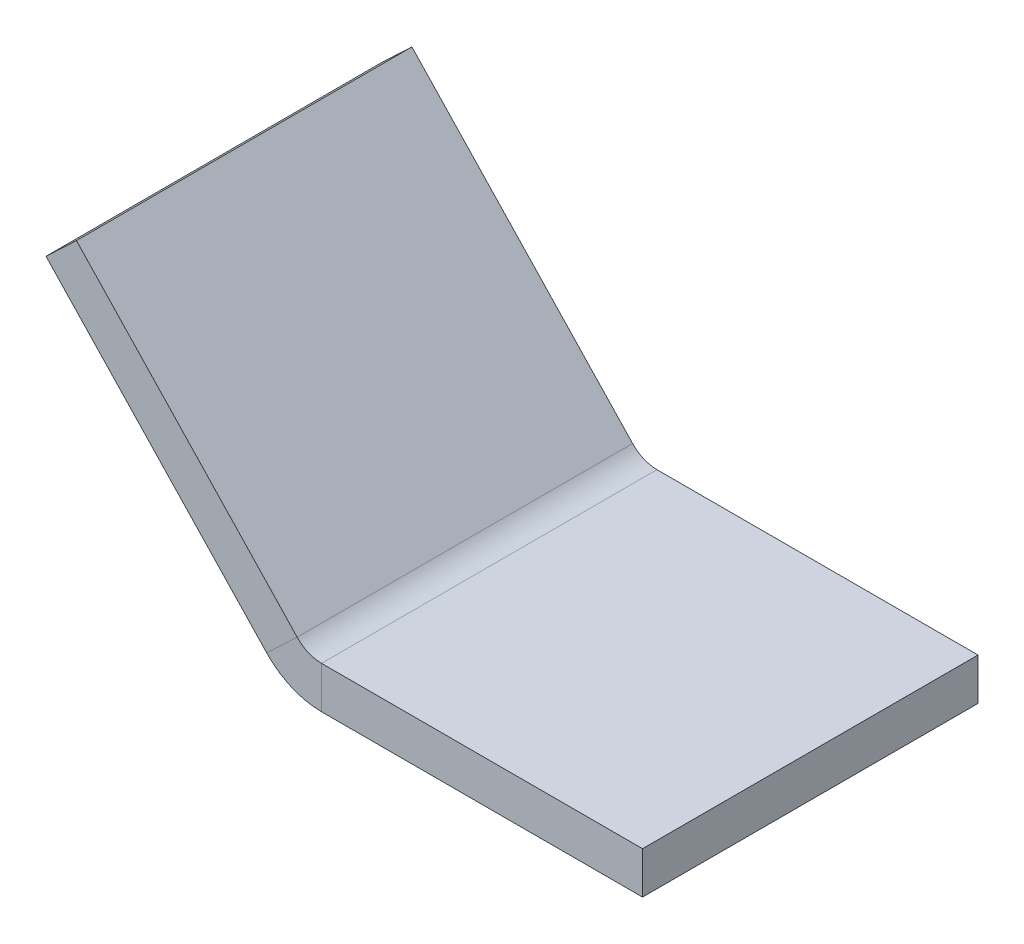
ISO-10303-21;
HEADER;
FILE_DESCRIPTION(('STEP AP214'),'2;1');
FILE_NAME('part.step','',(''),(''),'','','');
FILE_SCHEMA(('AUTOMOTIVE_DESIGN { 1 0 10303 214 1 1 1 1 }'));
ENDSEC;
DATA;
#1=APPLICATION_CONTEXT('core data for automotive mechanical design processes');
#2=APPLICATION_PROTOCOL_DEFINITION('international standard','automotive_design',2000,#1);
#3=PRODUCT_CONTEXT('',#1,'mechanical');
#4=PRODUCT('Part','Part','',(#3));
#5=PRODUCT_RELATED_PRODUCT_CATEGORY('part','',(#4));
#6=PRODUCT_DEFINITION_FORMATION('','',#4);
#7=PRODUCT_DEFINITION_CONTEXT('part definition',#1,'design');
#8=PRODUCT_DEFINITION('design','',#6,#7);
#9=PRODUCT_DEFINITION_SHAPE('','',#8);
#10=(LENGTH_UNIT() NAMED_UNIT(*) SI_UNIT(.MILLI.,.METRE.));
#11=(NAMED_UNIT(*) PLANE_ANGLE_UNIT() SI_UNIT($,.RADIAN.));
#12=(NAMED_UNIT(*) SI_UNIT($,.STERADIAN.) SOLID_ANGLE_UNIT());
#13=UNCERTAINTY_MEASURE_WITH_UNIT(LENGTH_MEASURE(1.E-05),#10,'distance_accuracy_value','');
#14=(GEOMETRIC_REPRESENTATION_CONTEXT(3) GLOBAL_UNCERTAINTY_ASSIGNED_CONTEXT((#13)) GLOBAL_UNIT_ASSIGNED_CONTEXT((#10,
#11,#12)) REPRESENTATION_CONTEXT('',''));
#15=CARTESIAN_POINT('',(0.,0.,0.));
#16=DIRECTION('',(0.,0.,1.));
#17=DIRECTION('',(1.,0.,0.));
#18=AXIS2_PLACEMENT_3D('',#15,#16,#17);
#19=CARTESIAN_POINT('',(0.546520994959475,0.,12.7));
#20=DIRECTION('',(0.,0.,1.));
#21=DIRECTION('',(1.,0.,0.));
#22=AXIS2_PLACEMENT_3D('',#19,#20,#21);
#23=PLANE('',#22);
#24=DIRECTION('',(0.,-1.,0.));
#25=VECTOR('',#24,1.);
#26=CARTESIAN_POINT('',(0.546520994959475,0.,12.7));
#27=LINE('',#26,#25);
#28=CARTESIAN_POINT('',(0.546520994959475,0.,12.7));
#29=VERTEX_POINT('',#28);
#30=CARTESIAN_POINT('',(0.546520994959475,-1.5875,12.7));
#31=VERTEX_POINT('',#30);
#32=EDGE_CURVE('E11',#29,#31,#27,.T.);
#33=ORIENTED_EDGE('',*,*,#32,.F.);
#34=CARTESIAN_POINT('',(0.546520994959475,1.27,12.7));
#35=DIRECTION('',(0.,0.,1.));
#36=DIRECTION('',(1.,0.,0.));
#37=AXIS2_PLACEMENT_3D('',#34,#35,#36);
#38=CIRCLE('',#37,1.27);
#39=CARTESIAN_POINT('',(-0.375733177885114,0.396875014290195,12.7));
#40=VERTEX_POINT('',#39);
#41=EDGE_CURVE('E143',#40,#29,#38,.T.);
#42=ORIENTED_EDGE('',*,*,#41,.F.);
#43=DIRECTION('',(0.726184388066605,0.687499988747876,0.));
#44=VECTOR('',#43,1.);
#45=CARTESIAN_POINT('',(-1.52855089394085,-0.694531217847057,12.7));
#46=LINE('',#45,#44);
#47=CARTESIAN_POINT('',(-1.52855089394085,-0.694531217847057,12.7));
#48=VERTEX_POINT('',#47);
#49=EDGE_CURVE('E49',#48,#40,#46,.T.);
#50=ORIENTED_EDGE('',*,*,#49,.F.);
#51=CARTESIAN_POINT('',(0.546520994959475,1.27,12.7));
#52=DIRECTION('',(0.,0.,1.));
#53=DIRECTION('',(1.,0.,0.));
#54=AXIS2_PLACEMENT_3D('',#51,#52,#53);
#55=CIRCLE('',#54,2.8575);
#56=EDGE_CURVE('E133',#48,#31,#55,.T.);
#57=ORIENTED_EDGE('',*,*,#56,.T.);
#58=EDGE_LOOP('',(#33,#42,#50,#57));
#59=FACE_BOUND('',#58,.T.);
#60=ADVANCED_FACE('F40',(#59),#23,.T.);
#61=CARTESIAN_POINT('',(-1.52855089394085,-0.694531217847057,12.7));
#62=DIRECTION('',(0.,0.,1.));
#63=DIRECTION('',(1.,0.,0.));
#64=AXIS2_PLACEMENT_3D('',#61,#62,#63);
#65=PLANE('',#64);
#66=DIRECTION('',(1.,0.,0.));
#67=VECTOR('',#66,1.);
#68=CARTESIAN_POINT('',(0.,0.,12.7));
#69=LINE('',#68,#67);
#70=CARTESIAN_POINT('',(12.7,0.,12.7));
#71=VERTEX_POINT('',#70);
#72=EDGE_CURVE('E213',#29,#71,#69,.T.);
#73=ORIENTED_EDGE('',*,*,#72,.F.);
#74=ORIENTED_EDGE('',*,*,#32,.T.);
#75=DIRECTION('',(1.,0.,0.));
#76=VECTOR('',#75,1.);
#77=CARTESIAN_POINT('',(0.,-1.5875,12.7));
#78=LINE('',#77,#76);
#79=CARTESIAN_POINT('',(12.7,-1.5875,12.7));
#80=VERTEX_POINT('',#79);
#81=EDGE_CURVE('E97',#31,#80,#78,.T.);
#82=ORIENTED_EDGE('',*,*,#81,.T.);
#83=DIRECTION('',(0.,-1.,0.));
#84=VECTOR('',#83,1.);
#85=CARTESIAN_POINT('',(12.7,0.,12.7));
#86=LINE('',#85,#84);
#87=EDGE_CURVE('E399',#71,#80,#86,.T.);
#88=ORIENTED_EDGE('',*,*,#87,.F.);
#89=EDGE_LOOP('',(#73,#74,#82,#88));
#90=FACE_BOUND('',#89,.T.);
#91=ADVANCED_FACE('F221',(#90),#65,.T.);
#92=CARTESIAN_POINT('',(-0.375733177885114,0.396875014290195,0.));
#93=DIRECTION('',(0.,0.,-1.));
#94=DIRECTION('',(-1.,0.,0.));
#95=AXIS2_PLACEMENT_3D('',#92,#93,#94);
#96=PLANE('',#95);
#97=DIRECTION('',(-0.726184388066605,-0.687499988747876,0.));
#98=VECTOR('',#97,1.);
#99=CARTESIAN_POINT('',(-0.375733177885114,0.396875014290195,0.));
#100=LINE('',#99,#98);
#101=CARTESIAN_POINT('',(-0.375733177885114,0.396875014290195,0.));
#102=VERTEX_POINT('',#101);
#103=CARTESIAN_POINT('',(-1.52855089394085,-0.694531217847057,0.));
#104=VERTEX_POINT('',#103);
#105=EDGE_CURVE('E84',#102,#104,#100,.T.);
#106=ORIENTED_EDGE('',*,*,#105,.F.);
#107=CARTESIAN_POINT('',(0.546520994959475,1.27,0.));
#108=DIRECTION('',(0.,0.,1.));
#109=DIRECTION('',(1.,0.,0.));
#110=AXIS2_PLACEMENT_3D('',#107,#108,#109);
#111=CIRCLE('',#110,1.27);
#112=CARTESIAN_POINT('',(0.546520994959475,0.,0.));
#113=VERTEX_POINT('',#112);
#114=EDGE_CURVE('E162',#102,#113,#111,.T.);
#115=ORIENTED_EDGE('',*,*,#114,.T.);
#116=DIRECTION('',(0.,1.,0.));
#117=VECTOR('',#116,1.);
#118=CARTESIAN_POINT('',(0.546520994959475,-1.5875,0.));
#119=LINE('',#118,#117);
#120=CARTESIAN_POINT('',(0.546520994959475,-1.5875,0.));
#121=VERTEX_POINT('',#120);
#122=EDGE_CURVE('E91',#121,#113,#119,.T.);
#123=ORIENTED_EDGE('',*,*,#122,.F.);
#124=CARTESIAN_POINT('',(0.546520994959475,1.27,0.));
#125=DIRECTION('',(0.,0.,1.));
#126=DIRECTION('',(1.,0.,0.));
#127=AXIS2_PLACEMENT_3D('',#124,#125,#126);
#128=CIRCLE('',#127,2.8575);
#129=EDGE_CURVE('E173',#104,#121,#128,.T.);
#130=ORIENTED_EDGE('',*,*,#129,.F.);
#131=EDGE_LOOP('',(#106,#115,#123,#130));
#132=FACE_BOUND('',#131,.T.);
#133=ADVANCED_FACE('F219',(#132),#96,.T.);
#134=CARTESIAN_POINT('',(0.546520994959475,-1.5875,0.));
#135=DIRECTION('',(0.,0.,-1.));
#136=DIRECTION('',(-1.,0.,0.));
#137=AXIS2_PLACEMENT_3D('',#134,#135,#136);
#138=PLANE('',#137);
#139=DIRECTION('',(0.687499988747877,-0.726184388066604,0.));
#140=VECTOR('',#139,1.);
#141=CARTESIAN_POINT('',(-8.73124985709804,9.22254172844588,0.));
#142=LINE('',#141,#140);
#143=CARTESIAN_POINT('',(-8.73124985709804,9.22254172844588,0.));
#144=VERTEX_POINT('',#143);
#145=EDGE_CURVE('E165',#144,#102,#142,.T.);
#146=ORIENTED_EDGE('',*,*,#145,.T.);
#147=ORIENTED_EDGE('',*,*,#105,.T.);
#148=DIRECTION('',(0.687499988747877,-0.726184388066604,0.));
#149=VECTOR('',#148,1.);
#150=CARTESIAN_POINT('',(-9.88406757315378,8.13113549630862,0.));
#151=LINE('',#150,#149);
#152=CARTESIAN_POINT('',(-9.88406757315378,8.13113549630862,0.));
#153=VERTEX_POINT('',#152);
#154=EDGE_CURVE('E170',#153,#104,#151,.T.);
#155=ORIENTED_EDGE('',*,*,#154,.F.);
#156=DIRECTION('',(0.726184388066604,0.687499988747877,0.));
#157=VECTOR('',#156,1.);
#158=CARTESIAN_POINT('',(-9.88406757315378,8.13113549630862,0.));
#159=LINE('',#158,#157);
#160=EDGE_CURVE('E119',#153,#144,#159,.T.);
#161=ORIENTED_EDGE('',*,*,#160,.T.);
#162=EDGE_LOOP('',(#146,#147,#155,#161));
#163=FACE_BOUND('',#162,.T.);
#164=ADVANCED_FACE('F215',(#163),#138,.T.);
#165=CARTESIAN_POINT('',(0.,-1.5875,12.7));
#166=DIRECTION('',(0.,1.,0.));
#167=DIRECTION('',(0.,0.,1.));
#168=AXIS2_PLACEMENT_3D('',#165,#166,#167);
#169=PLANE('',#168);
#170=DIRECTION('',(1.,0.,0.));
#171=VECTOR('',#170,1.);
#172=CARTESIAN_POINT('',(0.,-1.5875,0.));
#173=LINE('',#172,#171);
#174=CARTESIAN_POINT('',(12.7,-1.5875,0.));
#175=VERTEX_POINT('',#174);
#176=EDGE_CURVE('E150',#121,#175,#173,.T.);
#177=ORIENTED_EDGE('',*,*,#176,.T.);
#178=DIRECTION('',(0.,0.,-1.));
#179=VECTOR('',#178,1.);
#180=CARTESIAN_POINT('',(12.7,-1.5875,12.7));
#181=LINE('',#180,#179);
#182=EDGE_CURVE('E194',#80,#175,#181,.T.);
#183=ORIENTED_EDGE('',*,*,#182,.F.);
#184=ORIENTED_EDGE('',*,*,#81,.F.);
#185=DIRECTION('',(0.,0.,-1.));
#186=VECTOR('',#185,1.);
#187=CARTESIAN_POINT('',(0.546520994959475,-1.5875,12.7));
#188=LINE('',#187,#186);
#189=EDGE_CURVE('E149',#31,#121,#188,.T.);
#190=ORIENTED_EDGE('',*,*,#189,.T.);
#191=EDGE_LOOP('',(#177,#183,#184,#190));
#192=FACE_BOUND('',#191,.T.);
#193=ADVANCED_FACE('F227',(#192),#169,.F.);
#194=CARTESIAN_POINT('',(12.7,0.,12.7));
#195=DIRECTION('',(1.,0.,0.));
#196=DIRECTION('',(0.,0.,-1.));
#197=AXIS2_PLACEMENT_3D('',#194,#195,#196);
#198=PLANE('',#197);
#199=DIRECTION('',(0.,-1.,0.));
#200=VECTOR('',#199,1.);
#201=CARTESIAN_POINT('',(12.7,0.,0.));
#202=LINE('',#201,#200);
#203=CARTESIAN_POINT('',(12.7,0.,0.));
#204=VERTEX_POINT('',#203);
#205=EDGE_CURVE('E154',#204,#175,#202,.T.);
#206=ORIENTED_EDGE('',*,*,#205,.F.);
#207=DIRECTION('',(0.,0.,-1.));
#208=VECTOR('',#207,1.);
#209=CARTESIAN_POINT('',(12.7,0.,12.7));
#210=LINE('',#209,#208);
#211=EDGE_CURVE('E191',#71,#204,#210,.T.);
#212=ORIENTED_EDGE('',*,*,#211,.F.);
#213=ORIENTED_EDGE('',*,*,#87,.T.);
#214=ORIENTED_EDGE('',*,*,#182,.T.);
#215=EDGE_LOOP('',(#206,#212,#213,#214));
#216=FACE_BOUND('',#215,.T.);
#217=ADVANCED_FACE('F255',(#216),#198,.T.);
#218=CARTESIAN_POINT('',(0.,0.,12.7));
#219=DIRECTION('',(0.,1.,0.));
#220=DIRECTION('',(0.,0.,1.));
#221=AXIS2_PLACEMENT_3D('',#218,#219,#220);
#222=PLANE('',#221);
#223=DIRECTION('',(1.,0.,0.));
#224=VECTOR('',#223,1.);
#225=CARTESIAN_POINT('',(0.,0.,0.));
#226=LINE('',#225,#224);
#227=EDGE_CURVE('E158',#113,#204,#226,.T.);
#228=ORIENTED_EDGE('',*,*,#227,.F.);
#229=DIRECTION('',(0.,0.,-1.));
#230=VECTOR('',#229,1.);
#231=CARTESIAN_POINT('',(0.546520994959475,0.,12.7));
#232=LINE('',#231,#230);
#233=EDGE_CURVE('E187',#29,#113,#232,.T.);
#234=ORIENTED_EDGE('',*,*,#233,.F.);
#235=ORIENTED_EDGE('',*,*,#72,.T.);
#236=ORIENTED_EDGE('',*,*,#211,.T.);
#237=EDGE_LOOP('',(#228,#234,#235,#236));
#238=FACE_BOUND('',#237,.T.);
#239=ADVANCED_FACE('F265',(#238),#222,.T.);
#240=CARTESIAN_POINT('',(0.546520994959475,1.27,12.7));
#241=DIRECTION('',(0.,0.,-1.));
#242=DIRECTION('',(-1.,0.,0.));
#243=AXIS2_PLACEMENT_3D('',#240,#241,#242);
#244=CYLINDRICAL_SURFACE('',#243,1.27);
#245=ORIENTED_EDGE('',*,*,#114,.F.);
#246=DIRECTION('',(0.,0.,-1.));
#247=VECTOR('',#246,1.);
#248=CARTESIAN_POINT('',(-0.375733177885114,0.396875014290195,12.7));
#249=LINE('',#248,#247);
#250=EDGE_CURVE('E183',#40,#102,#249,.T.);
#251=ORIENTED_EDGE('',*,*,#250,.F.);
#252=ORIENTED_EDGE('',*,*,#41,.T.);
#253=ORIENTED_EDGE('',*,*,#233,.T.);
#254=EDGE_LOOP('',(#245,#251,#252,#253));
#255=FACE_BOUND('',#254,.T.);
#256=ADVANCED_FACE('F208',(#255),#244,.F.);
#257=CARTESIAN_POINT('',(-8.73124985709804,9.22254172844588,12.7));
#258=DIRECTION('',(0.726184388066604,0.687499988747877,0.));
#259=DIRECTION('',(-0.687499988747877,0.726184388066604,0.));
#260=AXIS2_PLACEMENT_3D('',#257,#258,#259);
#261=PLANE('',#260);
#262=ORIENTED_EDGE('',*,*,#145,.F.);
#263=DIRECTION('',(0.,0.,-1.));
#264=VECTOR('',#263,1.);
#265=CARTESIAN_POINT('',(-8.73124985709804,9.22254172844588,12.7));
#266=LINE('',#265,#264);
#267=CARTESIAN_POINT('',(-8.73124985709804,9.22254172844588,12.7));
#268=VERTEX_POINT('',#267);
#269=EDGE_CURVE('E122',#268,#144,#266,.T.);
#270=ORIENTED_EDGE('',*,*,#269,.F.);
#271=DIRECTION('',(0.687499988747877,-0.726184388066604,0.));
#272=VECTOR('',#271,1.);
#273=CARTESIAN_POINT('',(-8.73124985709804,9.22254172844588,12.7));
#274=LINE('',#273,#272);
#275=EDGE_CURVE('E138',#268,#40,#274,.T.);
#276=ORIENTED_EDGE('',*,*,#275,.T.);
#277=ORIENTED_EDGE('',*,*,#250,.T.);
#278=EDGE_LOOP('',(#262,#270,#276,#277));
#279=FACE_BOUND('',#278,.T.);
#280=ADVANCED_FACE('F214',(#279),#261,.T.);
#281=CARTESIAN_POINT('',(-9.88406757315378,8.13113549630862,12.7));
#282=DIRECTION('',(-0.687499988747877,0.726184388066604,0.));
#283=DIRECTION('',(-0.726184388066604,-0.687499988747877,0.));
#284=AXIS2_PLACEMENT_3D('',#281,#282,#283);
#285=PLANE('',#284);
#286=ORIENTED_EDGE('',*,*,#160,.F.);
#287=DIRECTION('',(0.,0.,-1.));
#288=VECTOR('',#287,1.);
#289=CARTESIAN_POINT('',(-9.88406757315378,8.13113549630862,12.7));
#290=LINE('',#289,#288);
#291=CARTESIAN_POINT('',(-9.88406757315378,8.13113549630862,12.7));
#292=VERTEX_POINT('',#291);
#293=EDGE_CURVE('E113',#292,#153,#290,.T.);
#294=ORIENTED_EDGE('',*,*,#293,.F.);
#295=DIRECTION('',(0.726184388066604,0.687499988747877,0.));
#296=VECTOR('',#295,1.);
#297=CARTESIAN_POINT('',(-9.88406757315378,8.13113549630862,12.7));
#298=LINE('',#297,#296);
#299=EDGE_CURVE('E117',#292,#268,#298,.T.);
#300=ORIENTED_EDGE('',*,*,#299,.T.);
#301=ORIENTED_EDGE('',*,*,#269,.T.);
#302=EDGE_LOOP('',(#286,#294,#300,#301));
#303=FACE_BOUND('',#302,.T.);
#304=ADVANCED_FACE('F115',(#303),#285,.T.);
#305=CARTESIAN_POINT('',(-9.88406757315378,8.13113549630862,12.7));
#306=DIRECTION('',(0.726184388066604,0.687499988747877,0.));
#307=DIRECTION('',(-0.687499988747877,0.726184388066604,0.));
#308=AXIS2_PLACEMENT_3D('',#305,#306,#307);
#309=PLANE('',#308);
#310=ORIENTED_EDGE('',*,*,#154,.T.);
#311=DIRECTION('',(0.,0.,-1.));
#312=VECTOR('',#311,1.);
#313=CARTESIAN_POINT('',(-1.52855089394085,-0.694531217847057,12.7));
#314=LINE('',#313,#312);
#315=EDGE_CURVE('E123',#48,#104,#314,.T.);
#316=ORIENTED_EDGE('',*,*,#315,.F.);
#317=DIRECTION('',(0.687499988747877,-0.726184388066604,0.));
#318=VECTOR('',#317,1.);
#319=CARTESIAN_POINT('',(-9.88406757315378,8.13113549630862,12.7));
#320=LINE('',#319,#318);
#321=EDGE_CURVE('E127',#292,#48,#320,.T.);
#322=ORIENTED_EDGE('',*,*,#321,.F.);
#323=ORIENTED_EDGE('',*,*,#293,.T.);
#324=EDGE_LOOP('',(#310,#316,#322,#323));
#325=FACE_BOUND('',#324,.T.);
#326=ADVANCED_FACE('F128',(#325),#309,.F.);
#327=CARTESIAN_POINT('',(0.546520994959475,1.27,12.7));
#328=DIRECTION('',(0.,0.,-1.));
#329=DIRECTION('',(-1.,0.,0.));
#330=AXIS2_PLACEMENT_3D('',#327,#328,#329);
#331=CYLINDRICAL_SURFACE('',#330,2.8575);
#332=ORIENTED_EDGE('',*,*,#129,.T.);
#333=ORIENTED_EDGE('',*,*,#189,.F.);
#334=ORIENTED_EDGE('',*,*,#56,.F.);
#335=ORIENTED_EDGE('',*,*,#315,.T.);
#336=EDGE_LOOP('',(#332,#333,#334,#335));
#337=FACE_BOUND('',#336,.T.);
#338=ADVANCED_FACE('F217',(#337),#331,.T.);
#339=CARTESIAN_POINT('',(0.546520994959475,1.27,12.7));
#340=DIRECTION('',(0.,0.,1.));
#341=DIRECTION('',(1.,0.,0.));
#342=AXIS2_PLACEMENT_3D('',#339,#340,#341);
#343=PLANE('',#342);
#344=ORIENTED_EDGE('',*,*,#321,.T.);
#345=ORIENTED_EDGE('',*,*,#49,.T.);
#346=ORIENTED_EDGE('',*,*,#275,.F.);
#347=ORIENTED_EDGE('',*,*,#299,.F.);
#348=EDGE_LOOP('',(#344,#345,#346,#347));
#349=FACE_BOUND('',#348,.T.);
#350=ADVANCED_FACE('F136',(#349),#343,.T.);
#351=CARTESIAN_POINT('',(0.546520994959475,1.27,0.));
#352=DIRECTION('',(0.,0.,1.));
#353=DIRECTION('',(1.,0.,0.));
#354=AXIS2_PLACEMENT_3D('',#351,#352,#353);
#355=PLANE('',#354);
#356=ORIENTED_EDGE('',*,*,#176,.F.);
#357=ORIENTED_EDGE('',*,*,#122,.T.);
#358=ORIENTED_EDGE('',*,*,#227,.T.);
#359=ORIENTED_EDGE('',*,*,#205,.T.);
#360=EDGE_LOOP('',(#356,#357,#358,#359));
#361=FACE_BOUND('',#360,.T.);
#362=ADVANCED_FACE('F324',(#361),#355,.F.);
#363=CLOSED_SHELL('',(#60,#91,#133,#164,#193,#217,#239,#256,#280,#304,#326,#338,#350,#362));
#364=MANIFOLD_SOLID_BREP('B2',#363);
#365=ADVANCED_BREP_SHAPE_REPRESENTATION('',(#18,#364),#14);
#366=SHAPE_DEFINITION_REPRESENTATION(#9,#365);
ENDSEC;
END-ISO-10303-21;
